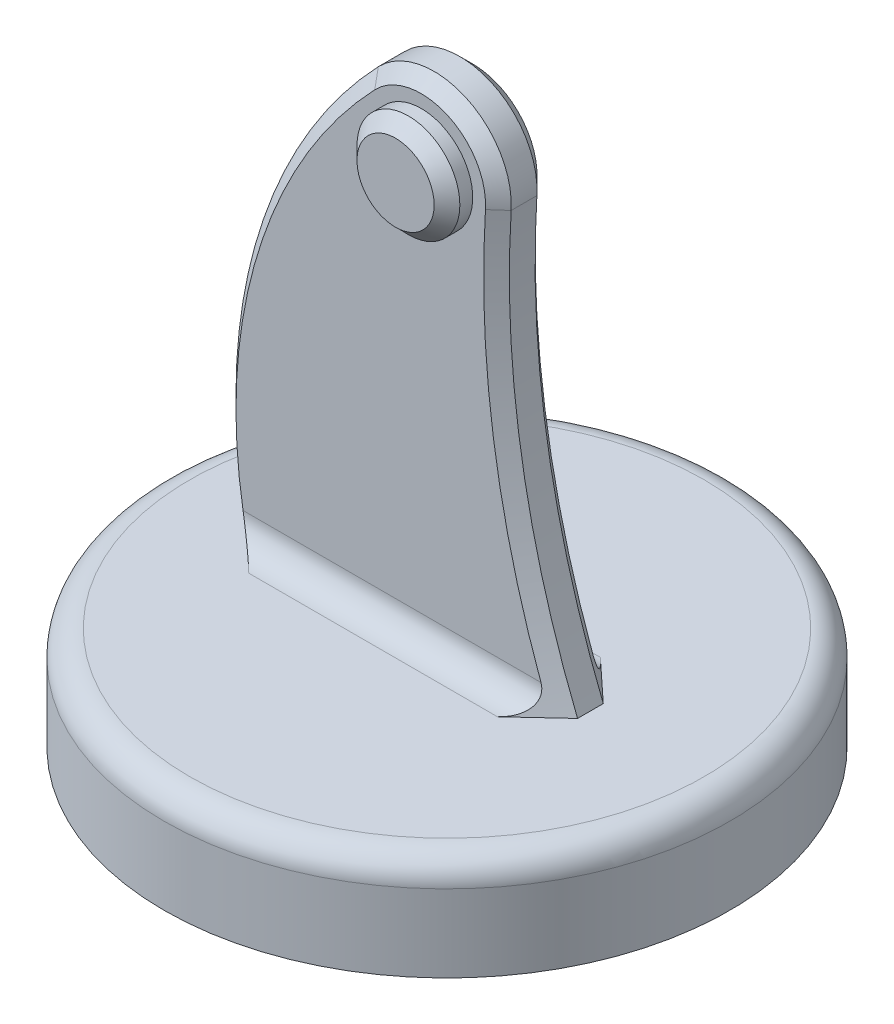
ISO-10303-21;
HEADER;
FILE_DESCRIPTION(('STEP AP214'),'2;1');
FILE_NAME('part.step','',(''),(''),'','','');
FILE_SCHEMA(('AUTOMOTIVE_DESIGN { 1 0 10303 214 1 1 1 1 }'));
ENDSEC;
DATA;
#1=APPLICATION_CONTEXT('core data for automotive mechanical design processes');
#2=APPLICATION_PROTOCOL_DEFINITION('international standard','automotive_design',2000,#1);
#3=PRODUCT_CONTEXT('',#1,'mechanical');
#4=PRODUCT('Part','Part','',(#3));
#5=PRODUCT_RELATED_PRODUCT_CATEGORY('part','',(#4));
#6=PRODUCT_DEFINITION_FORMATION('','',#4);
#7=PRODUCT_DEFINITION_CONTEXT('part definition',#1,'design');
#8=PRODUCT_DEFINITION('design','',#6,#7);
#9=PRODUCT_DEFINITION_SHAPE('','',#8);
#10=(LENGTH_UNIT() NAMED_UNIT(*) SI_UNIT(.MILLI.,.METRE.));
#11=(NAMED_UNIT(*) PLANE_ANGLE_UNIT() SI_UNIT($,.RADIAN.));
#12=(NAMED_UNIT(*) SI_UNIT($,.STERADIAN.) SOLID_ANGLE_UNIT());
#13=UNCERTAINTY_MEASURE_WITH_UNIT(LENGTH_MEASURE(1.E-05),#10,'distance_accuracy_value','');
#14=(GEOMETRIC_REPRESENTATION_CONTEXT(3) GLOBAL_UNCERTAINTY_ASSIGNED_CONTEXT((#13)) GLOBAL_UNIT_ASSIGNED_CONTEXT((#10,
#11,#12)) REPRESENTATION_CONTEXT('',''));
#15=CARTESIAN_POINT('',(0.,0.,0.));
#16=DIRECTION('',(0.,0.,1.));
#17=DIRECTION('',(1.,0.,0.));
#18=AXIS2_PLACEMENT_3D('',#15,#16,#17);
#19=CARTESIAN_POINT('',(0.,20.,0.));
#20=DIRECTION('',(0.,1.,0.));
#21=DIRECTION('',(0.,0.,1.));
#22=AXIS2_PLACEMENT_3D('',#19,#20,#21);
#23=PLANE('',#22);
#24=CARTESIAN_POINT('',(0.,20.,0.));
#25=DIRECTION('',(0.,1.,0.));
#26=DIRECTION('',(0.,0.,1.));
#27=AXIS2_PLACEMENT_3D('',#24,#25,#26);
#28=CIRCLE('',#27,50.);
#29=CARTESIAN_POINT('',(0.,20.,50.));
#30=VERTEX_POINT('',#29);
#31=EDGE_CURVE('E414',#30,#30,#28,.T.);
#32=ORIENTED_EDGE('',*,*,#31,.T.);
#33=EDGE_LOOP('',(#32));
#34=FACE_BOUND('',#33,.T.);
#35=CARTESIAN_POINT('',(-36.2257918410724,20.,-2.50000000000007));
#36=CARTESIAN_POINT('',(-35.372613344394,20.,-3.33359235450626));
#37=CARTESIAN_POINT('',(-34.5191891841924,20.,-4.16693335697093));
#38=CARTESIAN_POINT('',(-32.810937278002,20.,-5.83391380233446));
#39=CARTESIAN_POINT('',(-31.956108987226,20.,-6.66755268694826));
#40=CARTESIAN_POINT('',(-30.2458713230934,20.,-8.33423473891838));
#41=CARTESIAN_POINT('',(-29.3904619495462,20.,-9.16727790607911));
#42=CARTESIAN_POINT('',(-28.5347400447997,20.,-9.99999999999028));
#43=B_SPLINE_CURVE_WITH_KNOTS('',3,(#35,#36,#37,#38,#39,#40,#41,#42),.UNSPECIFIED.,.F.,.F.,(4,2,
2,4),(0.,3.57842257820062,7.16048411375372,10.7425468249047),.UNSPECIFIED.);
#44=CARTESIAN_POINT('',(-36.2257918410724,20.,-2.50000000000007));
#45=VERTEX_POINT('',#44);
#46=CARTESIAN_POINT('',(-28.5347400447997,20.,-10.));
#47=VERTEX_POINT('',#46);
#48=EDGE_CURVE('E209',#45,#47,#43,.T.);
#49=ORIENTED_EDGE('',*,*,#48,.T.);
#50=DIRECTION('',(-1.,0.,0.));
#51=VECTOR('',#50,1.);
#52=CARTESIAN_POINT('',(25.1824752050036,20.,-10.));
#53=LINE('',#52,#51);
#54=CARTESIAN_POINT('',(19.8084097202194,20.,-10.));
#55=VERTEX_POINT('',#54);
#56=EDGE_CURVE('E376',#47,#55,#53,.F.);
#57=ORIENTED_EDGE('',*,*,#56,.T.);
#58=CARTESIAN_POINT('',(19.8084097202194,20.,-10.));
#59=CARTESIAN_POINT('',(20.7032286114693,20.,-9.16574365323036));
#60=CARTESIAN_POINT('',(21.5984643871196,20.,-8.33193432974239));
#61=CARTESIAN_POINT('',(23.3898068938443,20.,-6.6652533617684));
#62=CARTESIAN_POINT('',(24.2859136241593,20.,-5.83238171646611));
#63=CARTESIAN_POINT('',(26.0805990637617,20.,-4.16616784041952));
#64=CARTESIAN_POINT('',(26.979179359604,20.,-3.332827318586));
#65=CARTESIAN_POINT('',(27.8782351753599,20.,-2.50000000000009));
#66=B_SPLINE_CURVE_WITH_KNOTS('',3,(#58,#59,#60,#61,#62,#63,#64,#65),.UNSPECIFIED.,.F.,.F.,(4,2,
2,4),(0.,3.67017170974673,7.34034022201694,11.0169040821689),.UNSPECIFIED.);
#67=CARTESIAN_POINT('',(27.8782351753599,20.,-2.50000000000008));
#68=VERTEX_POINT('',#67);
#69=EDGE_CURVE('E201',#55,#68,#66,.T.);
#70=ORIENTED_EDGE('',*,*,#69,.T.);
#71=DIRECTION('',(0.,0.,-1.));
#72=VECTOR('',#71,1.);
#73=CARTESIAN_POINT('',(27.8782351753599,20.,5.));
#74=LINE('',#73,#72);
#75=CARTESIAN_POINT('',(27.8782351753599,20.,2.5));
#76=VERTEX_POINT('',#75);
#77=EDGE_CURVE('E322',#68,#76,#74,.F.);
#78=ORIENTED_EDGE('',*,*,#77,.T.);
#79=CARTESIAN_POINT('',(27.8782351753599,20.,2.5));
#80=CARTESIAN_POINT('',(26.979179359604,20.,3.33282731858595));
#81=CARTESIAN_POINT('',(26.0805990637617,20.,4.1661678404195));
#82=CARTESIAN_POINT('',(24.2859136241592,20.,5.8323817164661));
#83=CARTESIAN_POINT('',(23.3898068938443,20.,6.66525336176839));
#84=CARTESIAN_POINT('',(21.5984643871196,20.,8.33193432974236));
#85=CARTESIAN_POINT('',(20.7032286114693,20.,9.16574365323033));
#86=CARTESIAN_POINT('',(19.8084097202194,20.,9.99999999999999));
#87=B_SPLINE_CURVE_WITH_KNOTS('',3,(#79,#80,#81,#82,#83,#84,#85,#86),.UNSPECIFIED.,.F.,.F.,(4,2,
2,4),(0.,3.67656386015204,7.34673237242222,11.0169040821689),.UNSPECIFIED.);
#88=CARTESIAN_POINT('',(19.8084097202194,20.,10.));
#89=VERTEX_POINT('',#88);
#90=EDGE_CURVE('E174',#76,#89,#87,.T.);
#91=ORIENTED_EDGE('',*,*,#90,.T.);
#92=DIRECTION('',(-1.,0.,0.));
#93=VECTOR('',#92,1.);
#94=CARTESIAN_POINT('',(0.,20.,10.));
#95=LINE('',#94,#93);
#96=CARTESIAN_POINT('',(-28.5347400448031,20.,10.));
#97=VERTEX_POINT('',#96);
#98=EDGE_CURVE('E371',#89,#97,#95,.T.);
#99=ORIENTED_EDGE('',*,*,#98,.T.);
#100=CARTESIAN_POINT('',(-28.534740044803,20.,9.99999999998702));
#101=CARTESIAN_POINT('',(-29.390461949549,20.,9.16727790607639));
#102=CARTESIAN_POINT('',(-30.2458713230956,20.,8.33423473891621));
#103=CARTESIAN_POINT('',(-31.9561089872271,20.,6.66755268694717));
#104=CARTESIAN_POINT('',(-32.8109372780025,20.,5.83391380233392));
#105=CARTESIAN_POINT('',(-34.5191891841924,20.,4.16693335697091));
#106=CARTESIAN_POINT('',(-35.372613344394,20.,3.33359235450621));
#107=CARTESIAN_POINT('',(-36.2257918410724,20.,2.49999999999999));
#108=B_SPLINE_CURVE_WITH_KNOTS('',3,(#100,#101,#102,#103,#104,#105,#106,#107),.UNSPECIFIED.,.F.,
.F.,(4,2,2,4),(0.,3.58206271114866,7.1641242466994,10.7425468249001),.UNSPECIFIED.);
#109=CARTESIAN_POINT('',(-36.2257918410724,20.,2.5));
#110=VERTEX_POINT('',#109);
#111=EDGE_CURVE('E165',#97,#110,#108,.T.);
#112=ORIENTED_EDGE('',*,*,#111,.T.);
#113=DIRECTION('',(0.,0.,-1.));
#114=VECTOR('',#113,1.);
#115=CARTESIAN_POINT('',(-36.2257918410724,20.,5.));
#116=LINE('',#115,#114);
#117=EDGE_CURVE('E133',#110,#45,#116,.T.);
#118=ORIENTED_EDGE('',*,*,#117,.T.);
#119=EDGE_LOOP('',(#49,#57,#70,#78,#91,#99,#112,#118));
#120=FACE_BOUND('',#119,.T.);
#121=ADVANCED_FACE('F46',(#34,#120),#23,.T.);
#122=CARTESIAN_POINT('',(0.,20.,0.));
#123=DIRECTION('',(0.,-1.,0.));
#124=DIRECTION('',(0.,0.,-1.));
#125=AXIS2_PLACEMENT_3D('',#122,#123,#124);
#126=CYLINDRICAL_SURFACE('',#125,55.);
#127=CARTESIAN_POINT('',(0.,15.,0.));
#128=DIRECTION('',(0.,1.,0.));
#129=DIRECTION('',(0.,0.,1.));
#130=AXIS2_PLACEMENT_3D('',#127,#128,#129);
#131=CIRCLE('',#130,55.);
#132=CARTESIAN_POINT('',(0.,15.,55.));
#133=VERTEX_POINT('',#132);
#134=EDGE_CURVE('E329',#133,#133,#131,.F.);
#135=ORIENTED_EDGE('',*,*,#134,.T.);
#136=EDGE_LOOP('',(#135));
#137=FACE_BOUND('',#136,.T.);
#138=CARTESIAN_POINT('',(0.,0.,0.));
#139=DIRECTION('',(0.,1.,0.));
#140=DIRECTION('',(0.,0.,1.));
#141=AXIS2_PLACEMENT_3D('',#138,#139,#140);
#142=CIRCLE('',#141,55.);
#143=CARTESIAN_POINT('',(0.,0.,55.));
#144=VERTEX_POINT('',#143);
#145=EDGE_CURVE('E410',#144,#144,#142,.T.);
#146=ORIENTED_EDGE('',*,*,#145,.T.);
#147=EDGE_LOOP('',(#146));
#148=FACE_BOUND('',#147,.T.);
#149=ADVANCED_FACE('F190',(#137,#148),#126,.T.);
#150=CARTESIAN_POINT('',(0.,0.,0.));
#151=DIRECTION('',(0.,1.,0.));
#152=DIRECTION('',(0.,0.,1.));
#153=AXIS2_PLACEMENT_3D('',#150,#151,#152);
#154=PLANE('',#153);
#155=CARTESIAN_POINT('',(0.,0.,0.));
#156=DIRECTION('',(0.,-1.,0.));
#157=DIRECTION('',(0.,0.,-1.));
#158=AXIS2_PLACEMENT_3D('',#155,#156,#157);
#159=CIRCLE('',#158,50.);
#160=CARTESIAN_POINT('',(0.,0.,-50.));
#161=VERTEX_POINT('',#160);
#162=EDGE_CURVE('E402',#161,#161,#159,.T.);
#163=ORIENTED_EDGE('',*,*,#162,.F.);
#164=EDGE_LOOP('',(#163));
#165=FACE_BOUND('',#164,.T.);
#166=ORIENTED_EDGE('',*,*,#145,.F.);
#167=EDGE_LOOP('',(#166));
#168=FACE_BOUND('',#167,.T.);
#169=ADVANCED_FACE('F194',(#165,#168),#154,.F.);
#170=CARTESIAN_POINT('',(0.,15.,0.));
#171=DIRECTION('',(0.,1.,0.));
#172=DIRECTION('',(0.,0.,1.));
#173=AXIS2_PLACEMENT_3D('',#170,#171,#172);
#174=TOROIDAL_SURFACE('',#173,50.,5.);
#175=ORIENTED_EDGE('',*,*,#134,.F.);
#176=EDGE_LOOP('',(#175));
#177=FACE_BOUND('',#176,.T.);
#178=ORIENTED_EDGE('',*,*,#31,.F.);
#179=EDGE_LOOP('',(#178));
#180=FACE_BOUND('',#179,.T.);
#181=ADVANCED_FACE('F318',(#177,#180),#174,.T.);
#182=CARTESIAN_POINT('',(61.4788080980091,41.3028437243492,5.));
#183=DIRECTION('',(0.,0.,-1.));
#184=DIRECTION('',(-1.,0.,0.));
#185=AXIS2_PLACEMENT_3D('',#182,#183,#184);
#186=CYLINDRICAL_SURFACE('',#185,100.);
#187=DIRECTION('',(0.,0.,-1.));
#188=VECTOR('',#187,1.);
#189=CARTESIAN_POINT('',(-10.8492014290605,110.358321695703,5.));
#190=LINE('',#189,#188);
#191=CARTESIAN_POINT('',(-10.8492014290605,110.358321695703,2.5));
#192=VERTEX_POINT('',#191);
#193=CARTESIAN_POINT('',(-10.8492014290605,110.358321695703,-2.50000000000007));
#194=VERTEX_POINT('',#193);
#195=EDGE_CURVE('E145',#192,#194,#190,.T.);
#196=ORIENTED_EDGE('',*,*,#195,.T.);
#197=CARTESIAN_POINT('',(61.4788080980091,41.3028437243492,-2.50000000000007));
#198=DIRECTION('',(0.,0.,-1.));
#199=DIRECTION('',(-1.,0.,0.));
#200=AXIS2_PLACEMENT_3D('',#197,#198,#199);
#201=CIRCLE('',#200,100.);
#202=EDGE_CURVE('E210',#194,#45,#201,.F.);
#203=ORIENTED_EDGE('',*,*,#202,.T.);
#204=ORIENTED_EDGE('',*,*,#117,.F.);
#205=CARTESIAN_POINT('',(61.4788080980091,41.3028437243492,2.5));
#206=DIRECTION('',(0.,0.,-1.));
#207=DIRECTION('',(-1.,0.,0.));
#208=AXIS2_PLACEMENT_3D('',#205,#206,#207);
#209=CIRCLE('',#208,100.);
#210=EDGE_CURVE('E154',#110,#192,#209,.T.);
#211=ORIENTED_EDGE('',*,*,#210,.T.);
#212=EDGE_LOOP('',(#196,#203,#204,#211));
#213=FACE_BOUND('',#212,.T.);
#214=ADVANCED_FACE('F192',(#213),#186,.T.);
#215=CARTESIAN_POINT('',(194.618391581677,87.8064911464742,5.));
#216=DIRECTION('',(0.,0.,-1.));
#217=DIRECTION('',(-1.,0.,0.));
#218=AXIS2_PLACEMENT_3D('',#215,#216,#217);
#219=CYLINDRICAL_SURFACE('',#218,180.);
#220=ORIENTED_EDGE('',*,*,#77,.F.);
#221=CARTESIAN_POINT('',(194.618391581677,87.8064911464742,-2.50000000000008));
#222=DIRECTION('',(0.,0.,-1.));
#223=DIRECTION('',(-1.,0.,0.));
#224=AXIS2_PLACEMENT_3D('',#221,#222,#223);
#225=CIRCLE('',#224,180.);
#226=CARTESIAN_POINT('',(14.9706455062829,99.0620377804981,-2.50000000000007));
#227=VERTEX_POINT('',#226);
#228=EDGE_CURVE('E325',#68,#227,#225,.T.);
#229=ORIENTED_EDGE('',*,*,#228,.T.);
#230=DIRECTION('',(0.,0.,-1.));
#231=VECTOR('',#230,1.);
#232=CARTESIAN_POINT('',(14.9706455062829,99.0620377804981,5.));
#233=LINE('',#232,#231);
#234=CARTESIAN_POINT('',(14.9706455062829,99.0620377804981,2.5));
#235=VERTEX_POINT('',#234);
#236=EDGE_CURVE('E407',#235,#227,#233,.T.);
#237=ORIENTED_EDGE('',*,*,#236,.F.);
#238=CARTESIAN_POINT('',(194.618391581677,87.8064911464742,2.5));
#239=DIRECTION('',(0.,0.,-1.));
#240=DIRECTION('',(-1.,0.,0.));
#241=AXIS2_PLACEMENT_3D('',#238,#239,#240);
#242=CIRCLE('',#241,180.);
#243=EDGE_CURVE('E141',#235,#76,#242,.F.);
#244=ORIENTED_EDGE('',*,*,#243,.T.);
#245=EDGE_LOOP('',(#220,#229,#237,#244));
#246=FACE_BOUND('',#245,.T.);
#247=ADVANCED_FACE('F310',(#246),#219,.F.);
#248=CARTESIAN_POINT('',(0.,100.,5.));
#249=DIRECTION('',(0.,0.,-1.));
#250=DIRECTION('',(-1.,0.,0.));
#251=AXIS2_PLACEMENT_3D('',#248,#249,#250);
#252=CYLINDRICAL_SURFACE('',#251,15.0000000000001);
#253=ORIENTED_EDGE('',*,*,#236,.T.);
#254=CARTESIAN_POINT('',(0.,100.,-2.50000000000007));
#255=DIRECTION('',(0.,0.,-1.));
#256=DIRECTION('',(-1.,0.,0.));
#257=AXIS2_PLACEMENT_3D('',#254,#255,#256);
#258=CIRCLE('',#257,15.0000000000001);
#259=EDGE_CURVE('E349',#227,#194,#258,.F.);
#260=ORIENTED_EDGE('',*,*,#259,.T.);
#261=ORIENTED_EDGE('',*,*,#195,.F.);
#262=CARTESIAN_POINT('',(0.,100.,2.5));
#263=DIRECTION('',(0.,0.,-1.));
#264=DIRECTION('',(-1.,0.,0.));
#265=AXIS2_PLACEMENT_3D('',#262,#263,#264);
#266=CIRCLE('',#265,15.0000000000001);
#267=EDGE_CURVE('E160',#192,#235,#266,.T.);
#268=ORIENTED_EDGE('',*,*,#267,.T.);
#269=EDGE_LOOP('',(#253,#260,#261,#268));
#270=FACE_BOUND('',#269,.T.);
#271=ADVANCED_FACE('F302',(#270),#252,.T.);
#272=CARTESIAN_POINT('',(61.4788080980091,41.3028437243492,5.));
#273=DIRECTION('',(0.,0.,-1.));
#274=DIRECTION('',(-1.,0.,0.));
#275=AXIS2_PLACEMENT_3D('',#272,#273,#274);
#276=PLANE('',#275);
#277=CARTESIAN_POINT('',(0.,100.,5.));
#278=DIRECTION('',(0.,0.,-1.));
#279=DIRECTION('',(-1.,0.,0.));
#280=AXIS2_PLACEMENT_3D('',#277,#278,#279);
#281=CIRCLE('',#280,10.);
#282=CARTESIAN_POINT('',(-10.,100.,5.));
#283=VERTEX_POINT('',#282);
#284=EDGE_CURVE('E273',#283,#283,#281,.F.);
#285=ORIENTED_EDGE('',*,*,#284,.F.);
#286=EDGE_LOOP('',(#285));
#287=FACE_BOUND('',#286,.T.);
#288=CARTESIAN_POINT('',(61.4788080980091,41.3028437243492,5.));
#289=DIRECTION('',(0.,0.,-1.));
#290=DIRECTION('',(-1.,0.,0.));
#291=AXIS2_PLACEMENT_3D('',#288,#289,#290);
#292=CIRCLE('',#291,97.5);
#293=CARTESIAN_POINT('',(-9.0410011908837,108.631934746419,5.));
#294=VERTEX_POINT('',#293);
#295=CARTESIAN_POINT('',(-34.6485412178825,25.,5.));
#296=VERTEX_POINT('',#295);
#297=EDGE_CURVE('E151',#294,#296,#292,.F.);
#298=ORIENTED_EDGE('',*,*,#297,.T.);
#299=DIRECTION('',(-1.,0.,0.));
#300=VECTOR('',#299,1.);
#301=CARTESIAN_POINT('',(61.4788080980091,25.,5.));
#302=LINE('',#301,#300);
#303=CARTESIAN_POINT('',(23.2661384016624,25.,5.));
#304=VERTEX_POINT('',#303);
#305=EDGE_CURVE('E63',#296,#304,#302,.F.);
#306=ORIENTED_EDGE('',*,*,#305,.T.);
#307=CARTESIAN_POINT('',(194.618391581677,87.8064911464742,5.));
#308=DIRECTION('',(0.,0.,-1.));
#309=DIRECTION('',(-1.,0.,0.));
#310=AXIS2_PLACEMENT_3D('',#307,#308,#309);
#311=CIRCLE('',#310,182.5);
#312=CARTESIAN_POINT('',(12.4755379219023,99.2183648170817,5.));
#313=VERTEX_POINT('',#312);
#314=EDGE_CURVE('E123',#304,#313,#311,.T.);
#315=ORIENTED_EDGE('',*,*,#314,.T.);
#316=CARTESIAN_POINT('',(0.,100.,5.));
#317=DIRECTION('',(0.,0.,-1.));
#318=DIRECTION('',(-1.,0.,0.));
#319=AXIS2_PLACEMENT_3D('',#316,#317,#318);
#320=CIRCLE('',#319,12.5);
#321=EDGE_CURVE('E127',#313,#294,#320,.F.);
#322=ORIENTED_EDGE('',*,*,#321,.T.);
#323=EDGE_LOOP('',(#298,#306,#315,#322));
#324=FACE_BOUND('',#323,.T.);
#325=ADVANCED_FACE('F125',(#287,#324),#276,.F.);
#326=CARTESIAN_POINT('',(61.4788080980091,41.3028437243492,-5.));
#327=DIRECTION('',(0.,0.,-1.));
#328=DIRECTION('',(-1.,0.,0.));
#329=AXIS2_PLACEMENT_3D('',#326,#327,#328);
#330=PLANE('',#329);
#331=CARTESIAN_POINT('',(0.,100.,-5.));
#332=DIRECTION('',(0.,0.,-1.));
#333=DIRECTION('',(-1.,0.,0.));
#334=AXIS2_PLACEMENT_3D('',#331,#332,#333);
#335=CIRCLE('',#334,5.);
#336=CARTESIAN_POINT('',(-5.,100.,-5.));
#337=VERTEX_POINT('',#336);
#338=EDGE_CURVE('E393',#337,#337,#335,.T.);
#339=ORIENTED_EDGE('',*,*,#338,.F.);
#340=EDGE_LOOP('',(#339));
#341=FACE_BOUND('',#340,.T.);
#342=CARTESIAN_POINT('',(194.618391581677,87.8064911464742,-5.));
#343=DIRECTION('',(0.,0.,-1.));
#344=DIRECTION('',(-1.,0.,0.));
#345=AXIS2_PLACEMENT_3D('',#342,#343,#344);
#346=CIRCLE('',#345,182.5);
#347=CARTESIAN_POINT('',(12.4755379219025,99.2183648170817,-5.));
#348=VERTEX_POINT('',#347);
#349=CARTESIAN_POINT('',(23.2661384016624,25.,-5.));
#350=VERTEX_POINT('',#349);
#351=EDGE_CURVE('E346',#348,#350,#346,.F.);
#352=ORIENTED_EDGE('',*,*,#351,.T.);
#353=DIRECTION('',(-1.,0.,0.));
#354=VECTOR('',#353,1.);
#355=CARTESIAN_POINT('',(-33.6654972978262,25.,-5.));
#356=LINE('',#355,#354);
#357=CARTESIAN_POINT('',(-34.6485412178826,25.,-5.));
#358=VERTEX_POINT('',#357);
#359=EDGE_CURVE('E368',#350,#358,#356,.T.);
#360=ORIENTED_EDGE('',*,*,#359,.T.);
#361=CARTESIAN_POINT('',(61.4788080980091,41.3028437243492,-5.));
#362=DIRECTION('',(0.,0.,-1.));
#363=DIRECTION('',(-1.,0.,0.));
#364=AXIS2_PLACEMENT_3D('',#361,#362,#363);
#365=CIRCLE('',#364,97.5);
#366=CARTESIAN_POINT('',(-9.04100119088373,108.631934746419,-5.));
#367=VERTEX_POINT('',#366);
#368=EDGE_CURVE('E337',#358,#367,#365,.T.);
#369=ORIENTED_EDGE('',*,*,#368,.T.);
#370=CARTESIAN_POINT('',(0.,100.,-5.));
#371=DIRECTION('',(0.,0.,-1.));
#372=DIRECTION('',(-1.,0.,0.));
#373=AXIS2_PLACEMENT_3D('',#370,#371,#372);
#374=CIRCLE('',#373,12.5000000000001);
#375=EDGE_CURVE('E341',#367,#348,#374,.T.);
#376=ORIENTED_EDGE('',*,*,#375,.T.);
#377=EDGE_LOOP('',(#352,#360,#369,#376));
#378=FACE_BOUND('',#377,.T.);
#379=ADVANCED_FACE('F301',(#341,#378),#330,.T.);
#380=CARTESIAN_POINT('',(194.618391581677,87.8064911464742,5.));
#381=DIRECTION('',(0.,0.,1.));
#382=DIRECTION('',(1.,0.,0.));
#383=AXIS2_PLACEMENT_3D('',#380,#381,#382);
#384=CONICAL_SURFACE('',#383,182.5,0.785398163397459);
#385=ORIENTED_EDGE('',*,*,#90,.F.);
#386=ORIENTED_EDGE('',*,*,#243,.F.);
#387=DIRECTION('',(0.705722997082177,-0.044215963060442,-0.707106781186538));
#388=VECTOR('',#387,1.);
#389=CARTESIAN_POINT('',(12.4755379219023,99.2183648170817,5.));
#390=LINE('',#389,#388);
#391=EDGE_CURVE('E137',#313,#235,#390,.T.);
#392=ORIENTED_EDGE('',*,*,#391,.F.);
#393=ORIENTED_EDGE('',*,*,#314,.F.);
#394=CARTESIAN_POINT('',(23.2661384016624,25.,5.));
#395=CARTESIAN_POINT('',(23.3002005671833,24.9070970588888,4.99998982101167));
#396=CARTESIAN_POINT('',(23.3319003658589,24.8132947634358,5.00258916549921));
#397=CARTESIAN_POINT('',(23.3901604515583,24.624343126443,5.01323591479231));
#398=CARTESIAN_POINT('',(23.4167170425787,24.5291928685387,5.02128721893147));
#399=CARTESIAN_POINT('',(23.4642590261445,24.3379983044757,5.04308274610182));
#400=CARTESIAN_POINT('',(23.4852365999852,24.2419529368185,5.05683489026829));
#401=CARTESIAN_POINT('',(23.5211837982653,24.0497650147842,5.09015681555101));
#402=CARTESIAN_POINT('',(23.5361548951619,23.9536224900254,5.10972516880294));
#403=CARTESIAN_POINT('',(23.5598434730769,23.7615087850931,5.15480488443814));
#404=CARTESIAN_POINT('',(23.5685335526405,23.6655401561134,5.18034165170113));
#405=CARTESIAN_POINT('',(23.579358971121,23.4749236099918,5.23722376580067));
#406=CARTESIAN_POINT('',(23.5814919758389,23.3802761751035,5.26857117691084));
#407=CARTESIAN_POINT('',(23.5791344482645,23.1932936963799,5.33677201100208));
#408=CARTESIAN_POINT('',(23.5746576512133,23.1009542616797,5.37361387353917));
#409=CARTESIAN_POINT('',(23.5591775223304,22.919061246429,5.45252524641228));
#410=CARTESIAN_POINT('',(23.5481717304808,22.8295087293356,5.49459672245525));
#411=CARTESIAN_POINT('',(23.520532895729,22.6581681393705,5.58133674973435));
#412=CARTESIAN_POINT('',(23.5042028834637,22.5762147571267,5.62577615786902));
#413=CARTESIAN_POINT('',(23.466096025912,22.4158463901558,5.71855815688244));
#414=CARTESIAN_POINT('',(23.4443173998559,22.3374325721739,5.76690202034875));
#415=CARTESIAN_POINT('',(23.3712669897884,22.1079558946016,5.91717329223243));
#416=CARTESIAN_POINT('',(23.3122859316015,21.9626892734793,6.02432427062641));
#417=CARTESIAN_POINT('',(23.151924605642,21.6389242665395,6.29030441266746));
#418=CARTESIAN_POINT('',(23.0429297160745,21.4679275550975,6.4536187634793));
#419=CARTESIAN_POINT('',(22.8002588719763,21.1580788280493,6.79181102146742));
#420=CARTESIAN_POINT('',(22.6665421365392,21.0192807927284,6.96670772427773));
#421=CARTESIAN_POINT('',(22.319763824735,20.7186526437609,7.39885475877627));
#422=CARTESIAN_POINT('',(22.0972299147782,20.5723698914756,7.65932857124395));
#423=CARTESIAN_POINT('',(21.7458214725293,20.3928428518393,8.05194856088023));
#424=CARTESIAN_POINT('',(21.6254999159944,20.3395856596789,8.18339715955418));
#425=CARTESIAN_POINT('',(21.380034828669,20.2454846645251,8.44627656448094));
#426=CARTESIAN_POINT('',(21.2548922835545,20.2046383390844,8.57770736891516));
#427=CARTESIAN_POINT('',(21.0216039690424,20.1402893934769,8.81843555286564));
#428=CARTESIAN_POINT('',(20.9140295433623,20.115042165326,8.92783397103434));
#429=CARTESIAN_POINT('',(20.6966536902156,20.0722321318853,9.14592246129717));
#430=CARTESIAN_POINT('',(20.5868522553934,20.0546693519809,9.25461253105012));
#431=CARTESIAN_POINT('',(20.3664141647905,20.0269838470988,9.47008454014684));
#432=CARTESIAN_POINT('',(20.2557937252112,20.0167960789621,9.57687485159776));
#433=CARTESIAN_POINT('',(20.0331107499652,20.0033093732439,9.78932326315866));
#434=CARTESIAN_POINT('',(19.9210486204084,20.0000085366556,9.89498166738485));
#435=CARTESIAN_POINT('',(19.8084097202194,20.,10.));
#436=B_SPLINE_CURVE_WITH_KNOTS('',3,(#394,#395,#396,#397,#398,#399,#400,#401,#402,#403,#404,
#405,#406,#407,#408,#409,#410,#411,#412,#413,#414,#415,#416,#417,#418,#419,#420,#421,#422,#423,
#424,#425,#426,#427,#428,#429,#430,#431,#432,#433,#434,#435),.UNSPECIFIED.,.F.,.F.,(4,2,2,2,2,2,
2,2,2,2,2,2,2,2,2,2,2,2,2,2,4),(0.,0.296831377796506,0.59387527895407,0.891333303938966,
1.18871836397785,1.48739308625392,1.78617411897318,2.08433515458881,2.38260860379718,
2.66622794573049,2.94994010430045,3.51747042312945,4.29430082789699,5.07242430682295,
6.18341813208096,6.7410845529198,7.29863755488184,7.76491483358028,8.23119365260233,
8.69330833935972,9.15529558547919),.UNSPECIFIED.);
#437=EDGE_CURVE('E266',#304,#89,#436,.T.);
#438=ORIENTED_EDGE('',*,*,#437,.T.);
#439=EDGE_LOOP('',(#385,#386,#392,#393,#438));
#440=FACE_BOUND('',#439,.T.);
#441=ADVANCED_FACE('F139',(#440),#384,.F.);
#442=CARTESIAN_POINT('',(0.,100.,5.));
#443=DIRECTION('',(0.,0.,-1.));
#444=DIRECTION('',(-1.,0.,0.));
#445=AXIS2_PLACEMENT_3D('',#442,#443,#444);
#446=CONICAL_SURFACE('',#445,12.5,0.785398163397456);
#447=ORIENTED_EDGE('',*,*,#391,.T.);
#448=ORIENTED_EDGE('',*,*,#267,.F.);
#449=DIRECTION('',(-0.511436260063165,0.488295967516228,-0.707106781186542));
#450=VECTOR('',#449,1.);
#451=CARTESIAN_POINT('',(-9.0410011908837,108.631934746419,5.));
#452=LINE('',#451,#450);
#453=EDGE_CURVE('E146',#294,#192,#452,.T.);
#454=ORIENTED_EDGE('',*,*,#453,.F.);
#455=ORIENTED_EDGE('',*,*,#321,.F.);
#456=EDGE_LOOP('',(#447,#448,#454,#455));
#457=FACE_BOUND('',#456,.T.);
#458=ADVANCED_FACE('F148',(#457),#446,.T.);
#459=CARTESIAN_POINT('',(61.4788080980091,41.3028437243492,5.));
#460=DIRECTION('',(0.,0.,-1.));
#461=DIRECTION('',(-1.,0.,0.));
#462=AXIS2_PLACEMENT_3D('',#459,#460,#461);
#463=CONICAL_SURFACE('',#462,97.5,0.785398163397448);
#464=ORIENTED_EDGE('',*,*,#453,.T.);
#465=ORIENTED_EDGE('',*,*,#210,.F.);
#466=ORIENTED_EDGE('',*,*,#111,.F.);
#467=CARTESIAN_POINT('',(-28.5347400448031,20.,10.));
#468=CARTESIAN_POINT('',(-28.6394037299064,20.0000054347712,9.8981505959117));
#469=CARTESIAN_POINT('',(-28.7444044701164,20.0031117141704,9.796678727258));
#470=CARTESIAN_POINT('',(-28.9548959741022,20.0154307584124,9.59462953883924));
#471=CARTESIAN_POINT('',(-29.0603867081547,20.024643157537,9.49405216586513));
#472=CARTESIAN_POINT('',(-29.3774210581348,20.0613070700199,9.19377282553882));
#473=CARTESIAN_POINT('',(-29.5894429565568,20.0977851443205,8.99560518422982));
#474=CARTESIAN_POINT('',(-30.0149470348654,20.1948303369441,8.60300164617394));
#475=CARTESIAN_POINT('',(-30.2284255575,20.2556075268319,8.40861421626809));
#476=CARTESIAN_POINT('',(-30.6533009098744,20.4012836398832,8.02679361368191));
#477=CARTESIAN_POINT('',(-30.8646984190351,20.4861744004963,7.83935811197524));
#478=CARTESIAN_POINT('',(-31.2358180513876,20.6583962515171,7.51482560987195));
#479=CARTESIAN_POINT('',(-31.3963375276211,20.7407622681892,7.37599142315639));
#480=CARTESIAN_POINT('',(-31.7140120771366,20.9205520104959,7.10437811445836));
#481=CARTESIAN_POINT('',(-31.8711678474192,21.0179725815714,6.97159773148201));
#482=CARTESIAN_POINT('',(-32.180485652204,21.2281280967806,6.71357483416427));
#483=CARTESIAN_POINT('',(-32.332660474765,21.3408192514843,6.58831219251157));
#484=CARTESIAN_POINT('',(-32.6308687242768,21.5823060586903,6.34643164579945));
#485=CARTESIAN_POINT('',(-32.7769045910202,21.7110952309633,6.22981029212455));
#486=CARTESIAN_POINT('',(-33.1114401131506,22.0342782323157,5.96739519381328));
#487=CARTESIAN_POINT('',(-33.2966353855764,22.2357416578193,5.8259204306083));
#488=CARTESIAN_POINT('',(-33.6456704142062,22.6710303913345,5.56832398351674));
#489=CARTESIAN_POINT('',(-33.8095301722187,22.9048249589197,5.45217848375585));
#490=CARTESIAN_POINT('',(-34.07071489561,23.3443131711598,5.27769119806821));
#491=CARTESIAN_POINT('',(-34.1745553911895,23.5431850809398,5.21216424392826));
#492=CARTESIAN_POINT('',(-34.3129103192236,23.8535368517297,5.13204069721164));
#493=CARTESIAN_POINT('',(-34.3560939901827,23.9588861391608,5.1083749219518));
#494=CARTESIAN_POINT('',(-34.4360284136753,24.1732140859579,5.06762637880023));
#495=CARTESIAN_POINT('',(-34.4727823057822,24.2821909429154,5.05054039316337));
#496=CARTESIAN_POINT('',(-34.5357563799718,24.4918108462668,5.02489103654152));
#497=CARTESIAN_POINT('',(-34.5626708259065,24.5921598661017,5.0156324261184));
#498=CARTESIAN_POINT('',(-34.6103490298529,24.7948018697911,5.0031760516126));
#499=CARTESIAN_POINT('',(-34.6311052843733,24.8970970648734,4.99998565599897));
#500=CARTESIAN_POINT('',(-34.6485412178825,25.,5.));
#501=B_SPLINE_CURVE_WITH_KNOTS('',3,(#467,#468,#469,#470,#471,#472,#473,#474,#475,#476,#477,
#478,#479,#480,#481,#482,#483,#484,#485,#486,#487,#488,#489,#490,#491,#492,#493,#494,#495,#496,
#497,#498,#499,#500),.UNSPECIFIED.,.F.,.F.,(4,2,2,2,2,2,2,2,2,2,2,2,2,2,2,2,4),(0.,
0.438046358394994,0.876066482942678,1.75245654358371,2.63659295843561,3.52043044511932,
4.20284499035328,4.88511673459583,5.56547186305163,6.24555399245017,7.16678571131549,
8.08714747012549,8.78553853655521,9.13405477039967,9.48240035063364,9.79495848647635,
10.1078959115114),.UNSPECIFIED.);
#502=EDGE_CURVE('E71',#97,#296,#501,.T.);
#503=ORIENTED_EDGE('',*,*,#502,.T.);
#504=ORIENTED_EDGE('',*,*,#297,.F.);
#505=EDGE_LOOP('',(#464,#465,#466,#503,#504));
#506=FACE_BOUND('',#505,.T.);
#507=ADVANCED_FACE('F182',(#506),#463,.T.);
#508=CARTESIAN_POINT('',(61.4788080980091,41.3028437243492,-2.50000000000007));
#509=DIRECTION('',(0.,0.,1.));
#510=DIRECTION('',(1.,0.,0.));
#511=AXIS2_PLACEMENT_3D('',#508,#509,#510);
#512=CONICAL_SURFACE('',#511,100.,0.785398163397454);
#513=ORIENTED_EDGE('',*,*,#48,.F.);
#514=ORIENTED_EDGE('',*,*,#202,.F.);
#515=DIRECTION('',(-0.511436260063164,0.488295967516228,0.707106781186544));
#516=VECTOR('',#515,1.);
#517=CARTESIAN_POINT('',(-9.04100119088373,108.631934746419,-5.));
#518=LINE('',#517,#516);
#519=EDGE_CURVE('E379',#367,#194,#518,.T.);
#520=ORIENTED_EDGE('',*,*,#519,.F.);
#521=ORIENTED_EDGE('',*,*,#368,.F.);
#522=CARTESIAN_POINT('',(-34.6485412178826,25.,-5.));
#523=CARTESIAN_POINT('',(-34.6278263931646,24.8776737195309,-4.99997205696548));
#524=CARTESIAN_POINT('',(-34.6024065399033,24.7562262915276,-5.00448739117206));
#525=CARTESIAN_POINT('',(-34.5429849208856,24.5162780856462,-5.02201019394859));
#526=CARTESIAN_POINT('',(-34.508997529844,24.3977727337697,-5.03500349551893));
#527=CARTESIAN_POINT('',(-34.4336064530608,24.1657504184647,-5.06870753536354));
#528=CARTESIAN_POINT('',(-34.3922873438699,24.0521932495797,-5.08933290323475));
#529=CARTESIAN_POINT('',(-34.3028186663442,23.8293395597508,-5.13763804893629));
#530=CARTESIAN_POINT('',(-34.2546663483715,23.7200447766429,-5.16532067014758));
#531=CARTESIAN_POINT('',(-34.1018999874642,23.4007855163625,-5.25749953763443));
#532=CARTESIAN_POINT('',(-33.988389425009,23.1977010164338,-5.33139897333394));
#533=CARTESIAN_POINT('',(-33.743108128065,22.8114075187661,-5.4994796684437));
#534=CARTESIAN_POINT('',(-33.6112792288649,22.6282652833932,-5.59372608368113));
#535=CARTESIAN_POINT('',(-33.3597715899798,22.3143795242672,-5.77930779563056));
#536=CARTESIAN_POINT('',(-33.2423430904442,22.1802045011359,-5.86796813176536));
#537=CARTESIAN_POINT('',(-33.0003701704359,21.9250062885372,-6.05419427532));
#538=CARTESIAN_POINT('',(-32.875822262786,21.803989629899,-6.15176446112314));
#539=CARTESIAN_POINT('',(-32.6209581839141,21.574515672378,-6.35451763345836));
#540=CARTESIAN_POINT('',(-32.4906317175558,21.4660821453441,-6.45971443821713));
#541=CARTESIAN_POINT('',(-32.2256565914919,21.261571364397,-6.6763962469599));
#542=CARTESIAN_POINT('',(-32.0910081512862,21.1654934842151,-6.7878809318187));
#543=CARTESIAN_POINT('',(-31.7670829795191,20.9513521781692,-7.05916234626258));
#544=CARTESIAN_POINT('',(-31.5762977372456,20.8386006241572,-7.22136644551829));
#545=CARTESIAN_POINT('',(-31.1903799013301,20.6347373401019,-7.55407285197026));
#546=CARTESIAN_POINT('',(-30.9952453847091,20.543635398434,-7.72457887087088));
#547=CARTESIAN_POINT('',(-30.6024455629516,20.3825905264103,-8.07225279463919));
#548=CARTESIAN_POINT('',(-30.4047817757244,20.312635473578,-8.24941681705508));
#549=CARTESIAN_POINT('',(-30.0083154260173,20.1935947017099,-8.60919264195968));
#550=CARTESIAN_POINT('',(-29.8095134145847,20.144499628215,-8.79180196315533));
#551=CARTESIAN_POINT('',(-29.430440932106,20.0707858186542,-9.14430295407235));
#552=CARTESIAN_POINT('',(-29.2501629713125,20.0443183217429,-9.31380200505615));
#553=CARTESIAN_POINT('',(-28.891175594643,20.0089730286601,-9.65518491269282));
#554=CARTESIAN_POINT('',(-28.7124631020955,20.0000429318062,-9.82706013433482));
#555=CARTESIAN_POINT('',(-28.5347400447949,20.,-9.99999999999489));
#556=B_SPLINE_CURVE_WITH_KNOTS('',3,(#522,#523,#524,#525,#526,#527,#528,#529,#530,#531,#532,
#533,#534,#535,#536,#537,#538,#539,#540,#541,#542,#543,#544,#545,#546,#547,#548,#549,#550,#551,
#552,#553,#554,#555),.UNSPECIFIED.,.F.,.F.,(4,2,2,2,2,2,2,2,2,2,2,2,2,2,2,2,4),(0.,
0.371910340457604,0.74320079101391,1.11045779196235,1.47786299596238,2.20715942536885,
2.93882682183085,3.53541228861897,4.13229251712415,4.73028261116156,5.32824238300979,
6.15097947183994,6.97408783764377,7.79672345698736,8.6189897828711,9.3649414633821,
10.1086651405441),.UNSPECIFIED.);
#557=EDGE_CURVE('E242',#358,#47,#556,.T.);
#558=ORIENTED_EDGE('',*,*,#557,.T.);
#559=EDGE_LOOP('',(#513,#514,#520,#521,#558));
#560=FACE_BOUND('',#559,.T.);
#561=ADVANCED_FACE('F258',(#560),#512,.T.);
#562=CARTESIAN_POINT('',(0.,100.,-2.50000000000007));
#563=DIRECTION('',(0.,0.,1.));
#564=DIRECTION('',(1.,0.,0.));
#565=AXIS2_PLACEMENT_3D('',#562,#563,#564);
#566=CONICAL_SURFACE('',#565,15.0000000000001,0.785398163397456);
#567=ORIENTED_EDGE('',*,*,#519,.T.);
#568=ORIENTED_EDGE('',*,*,#259,.F.);
#569=DIRECTION('',(0.705722997082174,-0.0442159630604435,0.707106781186542));
#570=VECTOR('',#569,1.);
#571=CARTESIAN_POINT('',(12.4755379219025,99.2183648170817,-5.));
#572=LINE('',#571,#570);
#573=EDGE_CURVE('E334',#348,#227,#572,.T.);
#574=ORIENTED_EDGE('',*,*,#573,.F.);
#575=ORIENTED_EDGE('',*,*,#375,.F.);
#576=EDGE_LOOP('',(#567,#568,#574,#575));
#577=FACE_BOUND('',#576,.T.);
#578=ADVANCED_FACE('F227',(#577),#566,.T.);
#579=CARTESIAN_POINT('',(194.618391581677,87.8064911464742,-2.50000000000008));
#580=DIRECTION('',(0.,0.,-1.));
#581=DIRECTION('',(-1.,0.,0.));
#582=AXIS2_PLACEMENT_3D('',#579,#580,#581);
#583=CONICAL_SURFACE('',#582,180.,0.785398163397465);
#584=ORIENTED_EDGE('',*,*,#69,.F.);
#585=CARTESIAN_POINT('',(19.8084097202194,20.,-10.));
#586=CARTESIAN_POINT('',(19.9616222001358,20.0000298804788,-9.85714704113474));
#587=CARTESIAN_POINT('',(20.1137924014269,20.0061250464787,-9.71309524720429));
#588=CARTESIAN_POINT('',(20.4154099258561,20.0312732005136,-9.42286389259006));
#589=CARTESIAN_POINT('',(20.5648530266055,20.0503447774578,-9.2766815742706));
#590=CARTESIAN_POINT('',(20.8615528966933,20.102562652016,-8.98125926298965));
#591=CARTESIAN_POINT('',(21.0087676549953,20.1358611613083,-8.83200332023088));
#592=CARTESIAN_POINT('',(21.2980316141232,20.2175964036353,-8.53280806026072));
#593=CARTESIAN_POINT('',(21.4400838108923,20.2660241950172,-8.38286919811185));
#594=CARTESIAN_POINT('',(21.7828151280984,20.4058352198909,-8.01276165533599));
#595=CARTESIAN_POINT('',(21.9797828513874,20.5067135935972,-7.79259954802388));
#596=CARTESIAN_POINT('',(22.3528762269486,20.7482032050806,-7.35729519112312));
#597=CARTESIAN_POINT('',(22.5290705137556,20.8886780845711,-7.14213841034355));
#598=CARTESIAN_POINT('',(22.8168193138976,21.1785477540736,-6.7689824570868));
#599=CARTESIAN_POINT('',(22.9340909878661,21.319317167827,-6.60875060095629));
#600=CARTESIAN_POINT('',(23.1447782575429,21.6294430522973,-6.30040897895645));
#601=CARTESIAN_POINT('',(23.2382153446302,21.7987735392681,-6.15228837499197));
#602=CARTESIAN_POINT('',(23.3804737185194,22.1320581970211,-5.89995104941322));
#603=CARTESIAN_POINT('',(23.4342962789319,22.2915049540279,-5.79262885058205));
#604=CARTESIAN_POINT('',(23.5179262343763,22.6263855761311,-5.59504489142651));
#605=CARTESIAN_POINT('',(23.5477623016994,22.8018000739711,-5.504762861239));
#606=CARTESIAN_POINT('',(23.5813327898913,23.1648092903734,-5.34473112728068));
#607=CARTESIAN_POINT('',(23.5849884501376,23.3524390501041,-5.27504398310999));
#608=CARTESIAN_POINT('',(23.5658130806125,23.7337098755049,-5.15889768650514));
#609=CARTESIAN_POINT('',(23.5429456120538,23.9273588546122,-5.11247061551668));
#610=CARTESIAN_POINT('',(23.4808763212381,24.2692712797722,-5.05137708232073));
#611=CARTESIAN_POINT('',(23.446701744559,24.4176298806951,-5.03183845273443));
#612=CARTESIAN_POINT('',(23.3858266399032,24.63802725972,-5.01257591131647));
#613=CARTESIAN_POINT('',(23.3639728403138,24.7110279587234,-5.00782892798884));
#614=CARTESIAN_POINT('',(23.3172604092299,24.8561887780631,-5.00154052901006));
#615=CARTESIAN_POINT('',(23.2924023157314,24.92834904637,-4.99999854031963));
#616=CARTESIAN_POINT('',(23.2661384016624,25.,-4.99999999999999));
#617=B_SPLINE_CURVE_WITH_KNOTS('',3,(#585,#586,#587,#588,#589,#590,#591,#592,#593,#594,#595,
#596,#597,#598,#599,#600,#601,#602,#603,#604,#605,#606,#607,#608,#609,#610,#611,#612,#613,#614,
#615,#616),.UNSPECIFIED.,.F.,.F.,(4,2,2,2,2,2,2,2,2,2,2,2,2,2,2,4),(0.,0.628421039599246,
1.25774420264553,1.89397597557041,2.52983243422467,3.46357701051969,4.39414453597988,
5.1217832645814,5.84876355163273,6.4450334028687,7.04058943781577,7.63793638210261,
8.23610496423004,8.695346247011,8.92427835401012,9.15316952540921),.UNSPECIFIED.);
#618=EDGE_CURVE('E233',#55,#350,#617,.T.);
#619=ORIENTED_EDGE('',*,*,#618,.T.);
#620=ORIENTED_EDGE('',*,*,#351,.F.);
#621=ORIENTED_EDGE('',*,*,#573,.T.);
#622=ORIENTED_EDGE('',*,*,#228,.F.);
#623=EDGE_LOOP('',(#584,#619,#620,#621,#622));
#624=FACE_BOUND('',#623,.T.);
#625=ADVANCED_FACE('F219',(#624),#583,.F.);
#626=CARTESIAN_POINT('',(61.4788080980091,25.,-10.));
#627=DIRECTION('',(1.,0.,0.));
#628=DIRECTION('',(0.,0.,-1.));
#629=AXIS2_PLACEMENT_3D('',#626,#627,#628);
#630=CYLINDRICAL_SURFACE('',#629,5.);
#631=ORIENTED_EDGE('',*,*,#618,.F.);
#632=ORIENTED_EDGE('',*,*,#56,.F.);
#633=ORIENTED_EDGE('',*,*,#557,.F.);
#634=ORIENTED_EDGE('',*,*,#359,.F.);
#635=EDGE_LOOP('',(#631,#632,#633,#634));
#636=FACE_BOUND('',#635,.T.);
#637=ADVANCED_FACE('F226',(#636),#630,.F.);
#638=CARTESIAN_POINT('',(0.,25.,10.));
#639=DIRECTION('',(-1.,0.,0.));
#640=DIRECTION('',(0.,0.,1.));
#641=AXIS2_PLACEMENT_3D('',#638,#639,#640);
#642=CYLINDRICAL_SURFACE('',#641,5.);
#643=ORIENTED_EDGE('',*,*,#437,.F.);
#644=ORIENTED_EDGE('',*,*,#305,.F.);
#645=ORIENTED_EDGE('',*,*,#502,.F.);
#646=ORIENTED_EDGE('',*,*,#98,.F.);
#647=EDGE_LOOP('',(#643,#644,#645,#646));
#648=FACE_BOUND('',#647,.T.);
#649=ADVANCED_FACE('F255',(#648),#642,.F.);
#650=CARTESIAN_POINT('',(0.,100.,10.));
#651=DIRECTION('',(0.,0.,-1.));
#652=DIRECTION('',(-1.,0.,0.));
#653=AXIS2_PLACEMENT_3D('',#650,#651,#652);
#654=CYLINDRICAL_SURFACE('',#653,10.);
#655=CARTESIAN_POINT('',(0.,100.,7.49999999999997));
#656=DIRECTION('',(0.,0.,1.));
#657=DIRECTION('',(1.,0.,0.));
#658=AXIS2_PLACEMENT_3D('',#655,#656,#657);
#659=CIRCLE('',#658,10.);
#660=CARTESIAN_POINT('',(10.,100.,7.49999999999997));
#661=VERTEX_POINT('',#660);
#662=EDGE_CURVE('E11',#661,#661,#659,.F.);
#663=ORIENTED_EDGE('',*,*,#662,.T.);
#664=EDGE_LOOP('',(#663));
#665=FACE_BOUND('',#664,.T.);
#666=ORIENTED_EDGE('',*,*,#284,.T.);
#667=EDGE_LOOP('',(#666));
#668=FACE_BOUND('',#667,.T.);
#669=ADVANCED_FACE('F263',(#665,#668),#654,.T.);
#670=CARTESIAN_POINT('',(0.,100.,10.));
#671=DIRECTION('',(0.,0.,1.));
#672=DIRECTION('',(1.,0.,0.));
#673=AXIS2_PLACEMENT_3D('',#670,#671,#672);
#674=PLANE('',#673);
#675=CARTESIAN_POINT('',(0.,100.,10.));
#676=DIRECTION('',(0.,0.,1.));
#677=DIRECTION('',(1.,0.,0.));
#678=AXIS2_PLACEMENT_3D('',#675,#676,#677);
#679=CIRCLE('',#678,7.49999999999998);
#680=CARTESIAN_POINT('',(7.49999999999998,100.,10.));
#681=VERTEX_POINT('',#680);
#682=EDGE_CURVE('E56',#681,#681,#679,.T.);
#683=ORIENTED_EDGE('',*,*,#682,.T.);
#684=EDGE_LOOP('',(#683));
#685=FACE_BOUND('',#684,.T.);
#686=ADVANCED_FACE('F280',(#685),#674,.T.);
#687=CARTESIAN_POINT('',(0.,100.,10.));
#688=DIRECTION('',(0.,0.,-1.));
#689=DIRECTION('',(-1.,0.,0.));
#690=AXIS2_PLACEMENT_3D('',#687,#688,#689);
#691=CONICAL_SURFACE('',#690,7.49999999999998,0.785398163397447);
#692=ORIENTED_EDGE('',*,*,#662,.F.);
#693=EDGE_LOOP('',(#692));
#694=FACE_BOUND('',#693,.T.);
#695=ORIENTED_EDGE('',*,*,#682,.F.);
#696=EDGE_LOOP('',(#695));
#697=FACE_BOUND('',#696,.T.);
#698=ADVANCED_FACE('F49',(#694,#697),#691,.T.);
#699=CARTESIAN_POINT('',(0.,100.,5.));
#700=DIRECTION('',(0.,0.,-1.));
#701=DIRECTION('',(-1.,0.,0.));
#702=AXIS2_PLACEMENT_3D('',#699,#700,#701);
#703=CYLINDRICAL_SURFACE('',#702,5.);
#704=CARTESIAN_POINT('',(0.,100.,5.));
#705=DIRECTION('',(0.,0.,-1.));
#706=DIRECTION('',(-1.,0.,0.));
#707=AXIS2_PLACEMENT_3D('',#704,#705,#706);
#708=CIRCLE('',#707,5.);
#709=CARTESIAN_POINT('',(-5.,100.,5.));
#710=VERTEX_POINT('',#709);
#711=EDGE_CURVE('E389',#710,#710,#708,.T.);
#712=ORIENTED_EDGE('',*,*,#711,.F.);
#713=EDGE_LOOP('',(#712));
#714=FACE_BOUND('',#713,.T.);
#715=ORIENTED_EDGE('',*,*,#338,.T.);
#716=EDGE_LOOP('',(#715));
#717=FACE_BOUND('',#716,.T.);
#718=ADVANCED_FACE('F283',(#714,#717),#703,.F.);
#719=CARTESIAN_POINT('',(0.,100.,5.));
#720=DIRECTION('',(0.,0.,-1.));
#721=DIRECTION('',(-1.,0.,0.));
#722=AXIS2_PLACEMENT_3D('',#719,#720,#721);
#723=PLANE('',#722);
#724=ORIENTED_EDGE('',*,*,#711,.T.);
#725=EDGE_LOOP('',(#724));
#726=FACE_BOUND('',#725,.T.);
#727=ADVANCED_FACE('F289',(#726),#723,.T.);
#728=CARTESIAN_POINT('',(0.,15.,0.));
#729=DIRECTION('',(0.,-1.,0.));
#730=DIRECTION('',(0.,0.,-1.));
#731=AXIS2_PLACEMENT_3D('',#728,#729,#730);
#732=CYLINDRICAL_SURFACE('',#731,50.);
#733=CARTESIAN_POINT('',(0.,15.,0.));
#734=DIRECTION('',(0.,-1.,0.));
#735=DIRECTION('',(0.,0.,-1.));
#736=AXIS2_PLACEMENT_3D('',#733,#734,#735);
#737=CIRCLE('',#736,50.);
#738=CARTESIAN_POINT('',(0.,15.,-50.));
#739=VERTEX_POINT('',#738);
#740=EDGE_CURVE('E399',#739,#739,#737,.T.);
#741=ORIENTED_EDGE('',*,*,#740,.F.);
#742=EDGE_LOOP('',(#741));
#743=FACE_BOUND('',#742,.T.);
#744=ORIENTED_EDGE('',*,*,#162,.T.);
#745=EDGE_LOOP('',(#744));
#746=FACE_BOUND('',#745,.T.);
#747=ADVANCED_FACE('F452',(#743,#746),#732,.F.);
#748=CARTESIAN_POINT('',(0.,15.,0.));
#749=DIRECTION('',(0.,-1.,0.));
#750=DIRECTION('',(0.,0.,-1.));
#751=AXIS2_PLACEMENT_3D('',#748,#749,#750);
#752=PLANE('',#751);
#753=ORIENTED_EDGE('',*,*,#740,.T.);
#754=EDGE_LOOP('',(#753));
#755=FACE_BOUND('',#754,.T.);
#756=ADVANCED_FACE('F457',(#755),#752,.T.);
#757=CLOSED_SHELL('',(#121,#149,#169,#181,#214,#247,#271,#325,#379,#441,#458,#507,#561,#578,
#625,#637,#649,#669,#686,#698,#718,#727,#747,#756));
#758=MANIFOLD_SOLID_BREP('B2',#757);
#759=ADVANCED_BREP_SHAPE_REPRESENTATION('',(#18,#758),#14);
#760=SHAPE_DEFINITION_REPRESENTATION(#9,#759);
ENDSEC;
END-ISO-10303-21;
